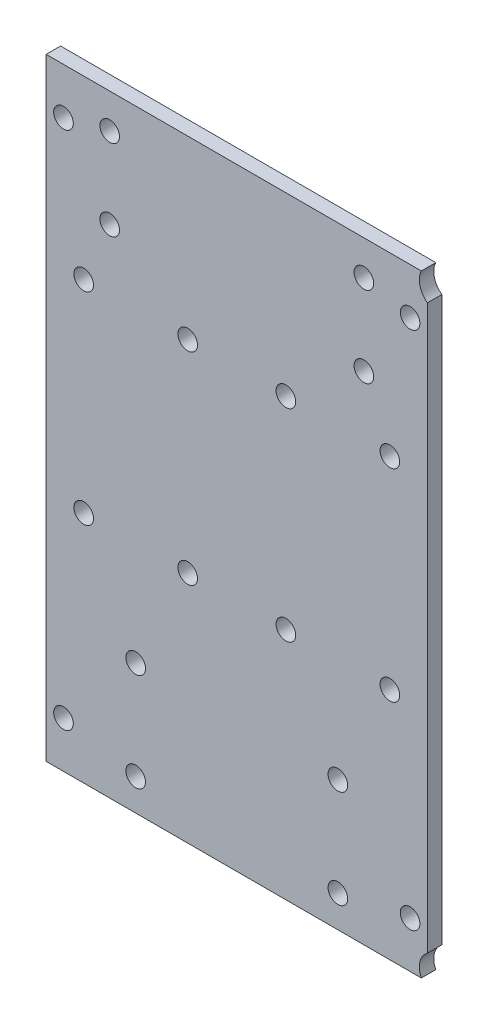
ISO-10303-21;
HEADER;
FILE_DESCRIPTION(('STEP AP214'),'2;1');
FILE_NAME('part.step','',(''),(''),'','','');
FILE_SCHEMA(('AUTOMOTIVE_DESIGN { 1 0 10303 214 1 1 1 1 }'));
ENDSEC;
DATA;
#1=APPLICATION_CONTEXT('core data for automotive mechanical design processes');
#2=APPLICATION_PROTOCOL_DEFINITION('international standard','automotive_design',2000,#1);
#3=PRODUCT_CONTEXT('',#1,'mechanical');
#4=PRODUCT('Part','Part','',(#3));
#5=PRODUCT_RELATED_PRODUCT_CATEGORY('part','',(#4));
#6=PRODUCT_DEFINITION_FORMATION('','',#4);
#7=PRODUCT_DEFINITION_CONTEXT('part definition',#1,'design');
#8=PRODUCT_DEFINITION('design','',#6,#7);
#9=PRODUCT_DEFINITION_SHAPE('','',#8);
#10=(LENGTH_UNIT() NAMED_UNIT(*) SI_UNIT(.MILLI.,.METRE.));
#11=(NAMED_UNIT(*) PLANE_ANGLE_UNIT() SI_UNIT($,.RADIAN.));
#12=(NAMED_UNIT(*) SI_UNIT($,.STERADIAN.) SOLID_ANGLE_UNIT());
#13=UNCERTAINTY_MEASURE_WITH_UNIT(LENGTH_MEASURE(1.E-05),#10,'distance_accuracy_value','');
#14=(GEOMETRIC_REPRESENTATION_CONTEXT(3) GLOBAL_UNCERTAINTY_ASSIGNED_CONTEXT((#13)) GLOBAL_UNIT_ASSIGNED_CONTEXT((#10,
#11,#12)) REPRESENTATION_CONTEXT('',''));
#15=CARTESIAN_POINT('',(0.,0.,0.));
#16=DIRECTION('',(0.,0.,1.));
#17=DIRECTION('',(1.,0.,0.));
#18=AXIS2_PLACEMENT_3D('',#15,#16,#17);
#19=CARTESIAN_POINT('',(-158.,53.,66.5));
#20=DIRECTION('',(-1.,0.,0.));
#21=DIRECTION('',(0.,0.,1.));
#22=AXIS2_PLACEMENT_3D('',#19,#20,#21);
#23=PLANE('',#22);
#24=DIRECTION('',(0.,-1.,0.));
#25=VECTOR('',#24,1.);
#26=CARTESIAN_POINT('',(-158.,53.,69.));
#27=LINE('',#26,#25);
#28=CARTESIAN_POINT('',(-158.,53.,69.));
#29=VERTEX_POINT('',#28);
#30=CARTESIAN_POINT('',(-158.,-53.,69.));
#31=VERTEX_POINT('',#30);
#32=EDGE_CURVE('E127',#29,#31,#27,.T.);
#33=ORIENTED_EDGE('',*,*,#32,.F.);
#34=DIRECTION('',(0.,0.,1.));
#35=VECTOR('',#34,1.);
#36=CARTESIAN_POINT('',(-158.,53.,66.5));
#37=LINE('',#36,#35);
#38=CARTESIAN_POINT('',(-158.,53.,66.5));
#39=VERTEX_POINT('',#38);
#40=EDGE_CURVE('E11',#39,#29,#37,.T.);
#41=ORIENTED_EDGE('',*,*,#40,.F.);
#42=DIRECTION('',(0.,-1.,0.));
#43=VECTOR('',#42,1.);
#44=CARTESIAN_POINT('',(-158.,53.,66.5));
#45=LINE('',#44,#43);
#46=CARTESIAN_POINT('',(-158.,-53.,66.5));
#47=VERTEX_POINT('',#46);
#48=EDGE_CURVE('E143',#39,#47,#45,.T.);
#49=ORIENTED_EDGE('',*,*,#48,.T.);
#50=DIRECTION('',(0.,0.,1.));
#51=VECTOR('',#50,1.);
#52=CARTESIAN_POINT('',(-158.,-53.,66.5));
#53=LINE('',#52,#51);
#54=EDGE_CURVE('E42',#47,#31,#53,.T.);
#55=ORIENTED_EDGE('',*,*,#54,.T.);
#56=EDGE_LOOP('',(#33,#41,#49,#55));
#57=FACE_BOUND('',#56,.T.);
#58=ADVANCED_FACE('F41',(#57),#23,.T.);
#59=CARTESIAN_POINT('',(-158.,53.,66.5));
#60=DIRECTION('',(0.,1.,0.));
#61=DIRECTION('',(0.,0.,1.));
#62=AXIS2_PLACEMENT_3D('',#59,#60,#61);
#63=PLANE('',#62);
#64=DIRECTION('',(-1.,0.,0.));
#65=VECTOR('',#64,1.);
#66=CARTESIAN_POINT('',(-158.,53.,69.));
#67=LINE('',#66,#65);
#68=CARTESIAN_POINT('',(-93.0512292604781,53.,69.));
#69=VERTEX_POINT('',#68);
#70=EDGE_CURVE('E136',#69,#29,#67,.T.);
#71=ORIENTED_EDGE('',*,*,#70,.F.);
#72=DIRECTION('',(0.,0.,1.));
#73=VECTOR('',#72,1.);
#74=CARTESIAN_POINT('',(-93.0512292604781,53.,66.5));
#75=LINE('',#74,#73);
#76=CARTESIAN_POINT('',(-93.0512292604781,53.,66.5));
#77=VERTEX_POINT('',#76);
#78=EDGE_CURVE('E49',#77,#69,#75,.T.);
#79=ORIENTED_EDGE('',*,*,#78,.F.);
#80=DIRECTION('',(-1.,0.,0.));
#81=VECTOR('',#80,1.);
#82=CARTESIAN_POINT('',(-158.,53.,66.5));
#83=LINE('',#82,#81);
#84=EDGE_CURVE('E117',#77,#39,#83,.T.);
#85=ORIENTED_EDGE('',*,*,#84,.T.);
#86=ORIENTED_EDGE('',*,*,#40,.T.);
#87=EDGE_LOOP('',(#71,#79,#85,#86));
#88=FACE_BOUND('',#87,.T.);
#89=ADVANCED_FACE('F149',(#88),#63,.T.);
#90=CARTESIAN_POINT('',(-90.0000000000001,51.5,66.5));
#91=DIRECTION('',(0.,0.,1.));
#92=DIRECTION('',(1.,0.,0.));
#93=AXIS2_PLACEMENT_3D('',#90,#91,#92);
#94=CYLINDRICAL_SURFACE('',#93,3.39999999999978);
#95=CARTESIAN_POINT('',(-90.0000000000001,51.5,69.));
#96=DIRECTION('',(0.,0.,-1.));
#97=DIRECTION('',(1.,0.,0.));
#98=AXIS2_PLACEMENT_3D('',#95,#96,#97);
#99=CIRCLE('',#98,3.39999999999978);
#100=CARTESIAN_POINT('',(-91.9999999999999,48.7504545830266,69.));
#101=VERTEX_POINT('',#100);
#102=EDGE_CURVE('E103',#101,#69,#99,.T.);
#103=ORIENTED_EDGE('',*,*,#102,.F.);
#104=DIRECTION('',(0.,0.,1.));
#105=VECTOR('',#104,1.);
#106=CARTESIAN_POINT('',(-91.9999999999999,48.7504545830266,66.5));
#107=LINE('',#106,#105);
#108=CARTESIAN_POINT('',(-91.9999999999999,48.7504545830266,66.5));
#109=VERTEX_POINT('',#108);
#110=EDGE_CURVE('E98',#109,#101,#107,.T.);
#111=ORIENTED_EDGE('',*,*,#110,.F.);
#112=CARTESIAN_POINT('',(-90.0000000000001,51.5,66.5));
#113=DIRECTION('',(0.,0.,-1.));
#114=DIRECTION('',(1.,0.,0.));
#115=AXIS2_PLACEMENT_3D('',#112,#113,#114);
#116=CIRCLE('',#115,3.39999999999978);
#117=EDGE_CURVE('E101',#109,#77,#116,.T.);
#118=ORIENTED_EDGE('',*,*,#117,.T.);
#119=ORIENTED_EDGE('',*,*,#78,.T.);
#120=EDGE_LOOP('',(#103,#111,#118,#119));
#121=FACE_BOUND('',#120,.T.);
#122=ADVANCED_FACE('F99',(#121),#94,.F.);
#123=CARTESIAN_POINT('',(-92.,48.7504545830265,66.5));
#124=DIRECTION('',(1.,0.,0.));
#125=DIRECTION('',(0.,0.,-1.));
#126=AXIS2_PLACEMENT_3D('',#123,#124,#125);
#127=PLANE('',#126);
#128=DIRECTION('',(0.,1.,0.));
#129=VECTOR('',#128,1.);
#130=CARTESIAN_POINT('',(-92.,48.7504545830265,69.));
#131=LINE('',#130,#129);
#132=CARTESIAN_POINT('',(-92.,-48.7504545830269,69.));
#133=VERTEX_POINT('',#132);
#134=EDGE_CURVE('E137',#133,#101,#131,.T.);
#135=ORIENTED_EDGE('',*,*,#134,.F.);
#136=DIRECTION('',(0.,0.,1.));
#137=VECTOR('',#136,1.);
#138=CARTESIAN_POINT('',(-92.,-48.7504545830269,66.5));
#139=LINE('',#138,#137);
#140=CARTESIAN_POINT('',(-92.,-48.7504545830269,66.5));
#141=VERTEX_POINT('',#140);
#142=EDGE_CURVE('E107',#141,#133,#139,.T.);
#143=ORIENTED_EDGE('',*,*,#142,.F.);
#144=DIRECTION('',(0.,1.,0.));
#145=VECTOR('',#144,1.);
#146=CARTESIAN_POINT('',(-92.,48.7504545830265,66.5));
#147=LINE('',#146,#145);
#148=EDGE_CURVE('E111',#141,#109,#147,.T.);
#149=ORIENTED_EDGE('',*,*,#148,.T.);
#150=ORIENTED_EDGE('',*,*,#110,.T.);
#151=EDGE_LOOP('',(#135,#143,#149,#150));
#152=FACE_BOUND('',#151,.T.);
#153=ADVANCED_FACE('F119',(#152),#127,.T.);
#154=CARTESIAN_POINT('',(-90.000000000001,-51.5000000000001,66.5));
#155=DIRECTION('',(0.,0.,1.));
#156=DIRECTION('',(1.,0.,0.));
#157=AXIS2_PLACEMENT_3D('',#154,#155,#156);
#158=CYLINDRICAL_SURFACE('',#157,3.39999999999932);
#159=CARTESIAN_POINT('',(-90.000000000001,-51.5000000000001,69.));
#160=DIRECTION('',(0.,0.,-1.));
#161=DIRECTION('',(1.,0.,0.));
#162=AXIS2_PLACEMENT_3D('',#159,#160,#161);
#163=CIRCLE('',#162,3.39999999999932);
#164=CARTESIAN_POINT('',(-93.0512292604786,-53.0000000000003,69.));
#165=VERTEX_POINT('',#164);
#166=EDGE_CURVE('E134',#165,#133,#163,.T.);
#167=ORIENTED_EDGE('',*,*,#166,.F.);
#168=DIRECTION('',(0.,0.,1.));
#169=VECTOR('',#168,1.);
#170=CARTESIAN_POINT('',(-93.0512292604786,-53.0000000000003,66.5));
#171=LINE('',#170,#169);
#172=CARTESIAN_POINT('',(-93.0512292604786,-53.0000000000003,66.5));
#173=VERTEX_POINT('',#172);
#174=EDGE_CURVE('E145',#173,#165,#171,.T.);
#175=ORIENTED_EDGE('',*,*,#174,.F.);
#176=CARTESIAN_POINT('',(-90.000000000001,-51.5000000000001,66.5));
#177=DIRECTION('',(0.,0.,-1.));
#178=DIRECTION('',(1.,0.,0.));
#179=AXIS2_PLACEMENT_3D('',#176,#177,#178);
#180=CIRCLE('',#179,3.39999999999932);
#181=EDGE_CURVE('E116',#173,#141,#180,.T.);
#182=ORIENTED_EDGE('',*,*,#181,.T.);
#183=ORIENTED_EDGE('',*,*,#142,.T.);
#184=EDGE_LOOP('',(#167,#175,#182,#183));
#185=FACE_BOUND('',#184,.T.);
#186=ADVANCED_FACE('F165',(#185),#158,.F.);
#187=CARTESIAN_POINT('',(-158.,-53.,66.5));
#188=DIRECTION('',(0.,-1.,0.));
#189=DIRECTION('',(1.,0.,0.));
#190=AXIS2_PLACEMENT_3D('',#187,#188,#189);
#191=PLANE('',#190);
#192=DIRECTION('',(1.,0.,0.));
#193=VECTOR('',#192,1.);
#194=CARTESIAN_POINT('',(-158.,-53.,69.));
#195=LINE('',#194,#193);
#196=EDGE_CURVE('E129',#31,#165,#195,.T.);
#197=ORIENTED_EDGE('',*,*,#196,.F.);
#198=ORIENTED_EDGE('',*,*,#54,.F.);
#199=DIRECTION('',(1.,0.,0.));
#200=VECTOR('',#199,1.);
#201=CARTESIAN_POINT('',(-158.,-53.,66.5));
#202=LINE('',#201,#200);
#203=EDGE_CURVE('E122',#47,#173,#202,.T.);
#204=ORIENTED_EDGE('',*,*,#203,.T.);
#205=ORIENTED_EDGE('',*,*,#174,.T.);
#206=EDGE_LOOP('',(#197,#198,#204,#205));
#207=FACE_BOUND('',#206,.T.);
#208=ADVANCED_FACE('F148',(#207),#191,.T.);
#209=CARTESIAN_POINT('',(-90.000000000001,-51.5000000000001,66.5));
#210=DIRECTION('',(0.,0.,1.));
#211=DIRECTION('',(1.,0.,0.));
#212=AXIS2_PLACEMENT_3D('',#209,#210,#211);
#213=PLANE('',#212);
#214=CARTESIAN_POINT('',(-95.,45.,66.5));
#215=DIRECTION('',(0.,0.,1.));
#216=DIRECTION('',(1.,0.,0.));
#217=AXIS2_PLACEMENT_3D('',#214,#215,#216);
#218=CIRCLE('',#217,1.69999999999999);
#219=CARTESIAN_POINT('',(-93.3,45.,66.5));
#220=VERTEX_POINT('',#219);
#221=EDGE_CURVE('E257',#220,#220,#218,.T.);
#222=ORIENTED_EDGE('',*,*,#221,.T.);
#223=EDGE_LOOP('',(#222));
#224=FACE_BOUND('',#223,.T.);
#225=CARTESIAN_POINT('',(-103.,47.,66.5));
#226=DIRECTION('',(0.,0.,1.));
#227=DIRECTION('',(1.,0.,0.));
#228=AXIS2_PLACEMENT_3D('',#225,#226,#227);
#229=CIRCLE('',#228,1.69999999999999);
#230=CARTESIAN_POINT('',(-101.3,47.,66.5));
#231=VERTEX_POINT('',#230);
#232=EDGE_CURVE('E268',#231,#231,#229,.T.);
#233=ORIENTED_EDGE('',*,*,#232,.T.);
#234=EDGE_LOOP('',(#233));
#235=FACE_BOUND('',#234,.T.);
#236=CARTESIAN_POINT('',(-103.,33.,66.5));
#237=DIRECTION('',(0.,0.,1.));
#238=DIRECTION('',(1.,0.,0.));
#239=AXIS2_PLACEMENT_3D('',#236,#237,#238);
#240=CIRCLE('',#239,1.69999999999999);
#241=CARTESIAN_POINT('',(-101.3,33.,66.5));
#242=VERTEX_POINT('',#241);
#243=EDGE_CURVE('E273',#242,#242,#240,.T.);
#244=ORIENTED_EDGE('',*,*,#243,.T.);
#245=EDGE_LOOP('',(#244));
#246=FACE_BOUND('',#245,.T.);
#247=CARTESIAN_POINT('',(-98.5,22.5,66.5));
#248=DIRECTION('',(0.,0.,1.));
#249=DIRECTION('',(1.,0.,0.));
#250=AXIS2_PLACEMENT_3D('',#247,#248,#249);
#251=CIRCLE('',#250,1.69999999999999);
#252=CARTESIAN_POINT('',(-96.8,22.5,66.5));
#253=VERTEX_POINT('',#252);
#254=EDGE_CURVE('E278',#253,#253,#251,.T.);
#255=ORIENTED_EDGE('',*,*,#254,.T.);
#256=EDGE_LOOP('',(#255));
#257=FACE_BOUND('',#256,.T.);
#258=CARTESIAN_POINT('',(-116.5,22.5,66.5));
#259=DIRECTION('',(0.,0.,1.));
#260=DIRECTION('',(1.,0.,0.));
#261=AXIS2_PLACEMENT_3D('',#258,#259,#260);
#262=CIRCLE('',#261,1.69999999999999);
#263=CARTESIAN_POINT('',(-114.8,22.5,66.5));
#264=VERTEX_POINT('',#263);
#265=EDGE_CURVE('E287',#264,#264,#262,.T.);
#266=ORIENTED_EDGE('',*,*,#265,.T.);
#267=EDGE_LOOP('',(#266));
#268=FACE_BOUND('',#267,.T.);
#269=CARTESIAN_POINT('',(-147.,47.,66.5));
#270=DIRECTION('',(0.,0.,1.));
#271=DIRECTION('',(1.,0.,0.));
#272=AXIS2_PLACEMENT_3D('',#269,#270,#271);
#273=CIRCLE('',#272,1.70000000000001);
#274=CARTESIAN_POINT('',(-145.3,47.,66.5));
#275=VERTEX_POINT('',#274);
#276=EDGE_CURVE('E295',#275,#275,#273,.T.);
#277=ORIENTED_EDGE('',*,*,#276,.T.);
#278=EDGE_LOOP('',(#277));
#279=FACE_BOUND('',#278,.T.);
#280=CARTESIAN_POINT('',(-155.,45.,66.5));
#281=DIRECTION('',(0.,0.,1.));
#282=DIRECTION('',(1.,0.,0.));
#283=AXIS2_PLACEMENT_3D('',#280,#281,#282);
#284=CIRCLE('',#283,1.70000000000001);
#285=CARTESIAN_POINT('',(-153.3,45.,66.5));
#286=VERTEX_POINT('',#285);
#287=EDGE_CURVE('E299',#286,#286,#284,.T.);
#288=ORIENTED_EDGE('',*,*,#287,.T.);
#289=EDGE_LOOP('',(#288));
#290=FACE_BOUND('',#289,.T.);
#291=CARTESIAN_POINT('',(-147.,33.,66.5));
#292=DIRECTION('',(0.,0.,1.));
#293=DIRECTION('',(1.,0.,0.));
#294=AXIS2_PLACEMENT_3D('',#291,#292,#293);
#295=CIRCLE('',#294,1.70000000000001);
#296=CARTESIAN_POINT('',(-145.3,33.,66.5));
#297=VERTEX_POINT('',#296);
#298=EDGE_CURVE('E301',#297,#297,#295,.T.);
#299=ORIENTED_EDGE('',*,*,#298,.T.);
#300=EDGE_LOOP('',(#299));
#301=FACE_BOUND('',#300,.T.);
#302=CARTESIAN_POINT('',(-133.5,22.5,66.5));
#303=DIRECTION('',(0.,0.,1.));
#304=DIRECTION('',(1.,0.,0.));
#305=AXIS2_PLACEMENT_3D('',#302,#303,#304);
#306=CIRCLE('',#305,1.70000000000001);
#307=CARTESIAN_POINT('',(-131.8,22.5,66.5));
#308=VERTEX_POINT('',#307);
#309=EDGE_CURVE('E309',#308,#308,#306,.T.);
#310=ORIENTED_EDGE('',*,*,#309,.T.);
#311=EDGE_LOOP('',(#310));
#312=FACE_BOUND('',#311,.T.);
#313=CARTESIAN_POINT('',(-151.5,22.5,66.5));
#314=DIRECTION('',(0.,0.,1.));
#315=DIRECTION('',(1.,0.,0.));
#316=AXIS2_PLACEMENT_3D('',#313,#314,#315);
#317=CIRCLE('',#316,1.70000000000001);
#318=CARTESIAN_POINT('',(-149.8,22.5,66.5));
#319=VERTEX_POINT('',#318);
#320=EDGE_CURVE('E316',#319,#319,#317,.T.);
#321=ORIENTED_EDGE('',*,*,#320,.T.);
#322=EDGE_LOOP('',(#321));
#323=FACE_BOUND('',#322,.T.);
#324=CARTESIAN_POINT('',(-98.5,-12.5,66.5));
#325=DIRECTION('',(0.,0.,1.));
#326=DIRECTION('',(1.,0.,0.));
#327=AXIS2_PLACEMENT_3D('',#324,#325,#326);
#328=CIRCLE('',#327,1.69999999999999);
#329=CARTESIAN_POINT('',(-96.8,-12.5,66.5));
#330=VERTEX_POINT('',#329);
#331=EDGE_CURVE('E325',#330,#330,#328,.T.);
#332=ORIENTED_EDGE('',*,*,#331,.T.);
#333=EDGE_LOOP('',(#332));
#334=FACE_BOUND('',#333,.T.);
#335=CARTESIAN_POINT('',(-116.5,-12.5,66.5));
#336=DIRECTION('',(0.,0.,1.));
#337=DIRECTION('',(1.,0.,0.));
#338=AXIS2_PLACEMENT_3D('',#335,#336,#337);
#339=CIRCLE('',#338,1.69999999999999);
#340=CARTESIAN_POINT('',(-114.8,-12.5,66.5));
#341=VERTEX_POINT('',#340);
#342=EDGE_CURVE('E327',#341,#341,#339,.T.);
#343=ORIENTED_EDGE('',*,*,#342,.T.);
#344=EDGE_LOOP('',(#343));
#345=FACE_BOUND('',#344,.T.);
#346=CARTESIAN_POINT('',(-107.5,-30.5,66.5));
#347=DIRECTION('',(0.,0.,1.));
#348=DIRECTION('',(1.,0.,0.));
#349=AXIS2_PLACEMENT_3D('',#346,#347,#348);
#350=CIRCLE('',#349,1.69999999999999);
#351=CARTESIAN_POINT('',(-105.8,-30.5,66.5));
#352=VERTEX_POINT('',#351);
#353=EDGE_CURVE('E331',#352,#352,#350,.T.);
#354=ORIENTED_EDGE('',*,*,#353,.T.);
#355=EDGE_LOOP('',(#354));
#356=FACE_BOUND('',#355,.T.);
#357=CARTESIAN_POINT('',(-95.,-45.,66.5));
#358=DIRECTION('',(0.,0.,1.));
#359=DIRECTION('',(1.,0.,0.));
#360=AXIS2_PLACEMENT_3D('',#357,#358,#359);
#361=CIRCLE('',#360,1.69999999999999);
#362=CARTESIAN_POINT('',(-93.3,-45.,66.5));
#363=VERTEX_POINT('',#362);
#364=EDGE_CURVE('E338',#363,#363,#361,.T.);
#365=ORIENTED_EDGE('',*,*,#364,.T.);
#366=EDGE_LOOP('',(#365));
#367=FACE_BOUND('',#366,.T.);
#368=CARTESIAN_POINT('',(-107.5,-47.5,66.5));
#369=DIRECTION('',(0.,0.,1.));
#370=DIRECTION('',(1.,0.,0.));
#371=AXIS2_PLACEMENT_3D('',#368,#369,#370);
#372=CIRCLE('',#371,1.69999999999999);
#373=CARTESIAN_POINT('',(-105.8,-47.5,66.5));
#374=VERTEX_POINT('',#373);
#375=EDGE_CURVE('E347',#374,#374,#372,.T.);
#376=ORIENTED_EDGE('',*,*,#375,.T.);
#377=EDGE_LOOP('',(#376));
#378=FACE_BOUND('',#377,.T.);
#379=CARTESIAN_POINT('',(-133.5,-12.5,66.5));
#380=DIRECTION('',(0.,0.,1.));
#381=DIRECTION('',(1.,0.,0.));
#382=AXIS2_PLACEMENT_3D('',#379,#380,#381);
#383=CIRCLE('',#382,1.70000000000001);
#384=CARTESIAN_POINT('',(-131.8,-12.5,66.5));
#385=VERTEX_POINT('',#384);
#386=EDGE_CURVE('E355',#385,#385,#383,.T.);
#387=ORIENTED_EDGE('',*,*,#386,.T.);
#388=EDGE_LOOP('',(#387));
#389=FACE_BOUND('',#388,.T.);
#390=CARTESIAN_POINT('',(-151.5,-12.5,66.5));
#391=DIRECTION('',(0.,0.,1.));
#392=DIRECTION('',(1.,0.,0.));
#393=AXIS2_PLACEMENT_3D('',#390,#391,#392);
#394=CIRCLE('',#393,1.70000000000001);
#395=CARTESIAN_POINT('',(-149.8,-12.5,66.5));
#396=VERTEX_POINT('',#395);
#397=EDGE_CURVE('E359',#396,#396,#394,.T.);
#398=ORIENTED_EDGE('',*,*,#397,.T.);
#399=EDGE_LOOP('',(#398));
#400=FACE_BOUND('',#399,.T.);
#401=CARTESIAN_POINT('',(-142.5,-30.5,66.5));
#402=DIRECTION('',(0.,0.,1.));
#403=DIRECTION('',(1.,0.,0.));
#404=AXIS2_PLACEMENT_3D('',#401,#402,#403);
#405=CIRCLE('',#404,1.70000000000001);
#406=CARTESIAN_POINT('',(-140.8,-30.5,66.5));
#407=VERTEX_POINT('',#406);
#408=EDGE_CURVE('E365',#407,#407,#405,.T.);
#409=ORIENTED_EDGE('',*,*,#408,.T.);
#410=EDGE_LOOP('',(#409));
#411=FACE_BOUND('',#410,.T.);
#412=CARTESIAN_POINT('',(-142.5,-47.5,66.5));
#413=DIRECTION('',(0.,0.,1.));
#414=DIRECTION('',(1.,0.,0.));
#415=AXIS2_PLACEMENT_3D('',#412,#413,#414);
#416=CIRCLE('',#415,1.70000000000001);
#417=CARTESIAN_POINT('',(-140.8,-47.5,66.5));
#418=VERTEX_POINT('',#417);
#419=EDGE_CURVE('E367',#418,#418,#416,.T.);
#420=ORIENTED_EDGE('',*,*,#419,.T.);
#421=EDGE_LOOP('',(#420));
#422=FACE_BOUND('',#421,.T.);
#423=CARTESIAN_POINT('',(-155.,-45.,66.5));
#424=DIRECTION('',(0.,0.,1.));
#425=DIRECTION('',(1.,0.,0.));
#426=AXIS2_PLACEMENT_3D('',#423,#424,#425);
#427=CIRCLE('',#426,1.70000000000001);
#428=CARTESIAN_POINT('',(-153.3,-45.,66.5));
#429=VERTEX_POINT('',#428);
#430=EDGE_CURVE('E128',#429,#429,#427,.T.);
#431=ORIENTED_EDGE('',*,*,#430,.T.);
#432=EDGE_LOOP('',(#431));
#433=FACE_BOUND('',#432,.T.);
#434=ORIENTED_EDGE('',*,*,#48,.F.);
#435=ORIENTED_EDGE('',*,*,#84,.F.);
#436=ORIENTED_EDGE('',*,*,#117,.F.);
#437=ORIENTED_EDGE('',*,*,#148,.F.);
#438=ORIENTED_EDGE('',*,*,#181,.F.);
#439=ORIENTED_EDGE('',*,*,#203,.F.);
#440=EDGE_LOOP('',(#434,#435,#436,#437,#438,#439));
#441=FACE_BOUND('',#440,.T.);
#442=ADVANCED_FACE('F115',(#224,#235,#246,#257,#268,#279,#290,#301,#312,#323,#334,#345,#356,
#367,#378,#389,#400,#411,#422,#433,#441),#213,.F.);
#443=CARTESIAN_POINT('',(-90.000000000001,-51.5000000000001,69.));
#444=DIRECTION('',(0.,0.,1.));
#445=DIRECTION('',(1.,0.,0.));
#446=AXIS2_PLACEMENT_3D('',#443,#444,#445);
#447=PLANE('',#446);
#448=CARTESIAN_POINT('',(-95.,45.,69.));
#449=DIRECTION('',(0.,0.,1.));
#450=DIRECTION('',(1.,0.,0.));
#451=AXIS2_PLACEMENT_3D('',#448,#449,#450);
#452=CIRCLE('',#451,1.69999999999999);
#453=CARTESIAN_POINT('',(-93.3,45.,69.));
#454=VERTEX_POINT('',#453);
#455=EDGE_CURVE('E263',#454,#454,#452,.T.);
#456=ORIENTED_EDGE('',*,*,#455,.F.);
#457=EDGE_LOOP('',(#456));
#458=FACE_BOUND('',#457,.T.);
#459=CARTESIAN_POINT('',(-103.,47.,69.));
#460=DIRECTION('',(0.,0.,1.));
#461=DIRECTION('',(1.,0.,0.));
#462=AXIS2_PLACEMENT_3D('',#459,#460,#461);
#463=CIRCLE('',#462,1.69999999999999);
#464=CARTESIAN_POINT('',(-101.3,47.,69.));
#465=VERTEX_POINT('',#464);
#466=EDGE_CURVE('E264',#465,#465,#463,.T.);
#467=ORIENTED_EDGE('',*,*,#466,.F.);
#468=EDGE_LOOP('',(#467));
#469=FACE_BOUND('',#468,.T.);
#470=CARTESIAN_POINT('',(-103.,33.,69.));
#471=DIRECTION('',(0.,0.,1.));
#472=DIRECTION('',(1.,0.,0.));
#473=AXIS2_PLACEMENT_3D('',#470,#471,#472);
#474=CIRCLE('',#473,1.69999999999999);
#475=CARTESIAN_POINT('',(-101.3,33.,69.));
#476=VERTEX_POINT('',#475);
#477=EDGE_CURVE('E271',#476,#476,#474,.T.);
#478=ORIENTED_EDGE('',*,*,#477,.F.);
#479=EDGE_LOOP('',(#478));
#480=FACE_BOUND('',#479,.T.);
#481=CARTESIAN_POINT('',(-98.5,22.5,69.));
#482=DIRECTION('',(0.,0.,1.));
#483=DIRECTION('',(1.,0.,0.));
#484=AXIS2_PLACEMENT_3D('',#481,#482,#483);
#485=CIRCLE('',#484,1.69999999999999);
#486=CARTESIAN_POINT('',(-96.8,22.5,69.));
#487=VERTEX_POINT('',#486);
#488=EDGE_CURVE('E280',#487,#487,#485,.T.);
#489=ORIENTED_EDGE('',*,*,#488,.F.);
#490=EDGE_LOOP('',(#489));
#491=FACE_BOUND('',#490,.T.);
#492=CARTESIAN_POINT('',(-116.5,22.5,69.));
#493=DIRECTION('',(0.,0.,1.));
#494=DIRECTION('',(1.,0.,0.));
#495=AXIS2_PLACEMENT_3D('',#492,#493,#494);
#496=CIRCLE('',#495,1.69999999999999);
#497=CARTESIAN_POINT('',(-114.8,22.5,69.));
#498=VERTEX_POINT('',#497);
#499=EDGE_CURVE('E284',#498,#498,#496,.T.);
#500=ORIENTED_EDGE('',*,*,#499,.F.);
#501=EDGE_LOOP('',(#500));
#502=FACE_BOUND('',#501,.T.);
#503=CARTESIAN_POINT('',(-147.,47.,69.));
#504=DIRECTION('',(0.,0.,1.));
#505=DIRECTION('',(1.,0.,0.));
#506=AXIS2_PLACEMENT_3D('',#503,#504,#505);
#507=CIRCLE('',#506,1.70000000000001);
#508=CARTESIAN_POINT('',(-145.3,47.,69.));
#509=VERTEX_POINT('',#508);
#510=EDGE_CURVE('E286',#509,#509,#507,.T.);
#511=ORIENTED_EDGE('',*,*,#510,.F.);
#512=EDGE_LOOP('',(#511));
#513=FACE_BOUND('',#512,.T.);
#514=CARTESIAN_POINT('',(-155.,45.,69.));
#515=DIRECTION('',(0.,0.,1.));
#516=DIRECTION('',(1.,0.,0.));
#517=AXIS2_PLACEMENT_3D('',#514,#515,#516);
#518=CIRCLE('',#517,1.70000000000001);
#519=CARTESIAN_POINT('',(-153.3,45.,69.));
#520=VERTEX_POINT('',#519);
#521=EDGE_CURVE('E293',#520,#520,#518,.T.);
#522=ORIENTED_EDGE('',*,*,#521,.F.);
#523=EDGE_LOOP('',(#522));
#524=FACE_BOUND('',#523,.T.);
#525=CARTESIAN_POINT('',(-147.,33.,69.));
#526=DIRECTION('',(0.,0.,1.));
#527=DIRECTION('',(1.,0.,0.));
#528=AXIS2_PLACEMENT_3D('',#525,#526,#527);
#529=CIRCLE('',#528,1.70000000000001);
#530=CARTESIAN_POINT('',(-145.3,33.,69.));
#531=VERTEX_POINT('',#530);
#532=EDGE_CURVE('E302',#531,#531,#529,.T.);
#533=ORIENTED_EDGE('',*,*,#532,.F.);
#534=EDGE_LOOP('',(#533));
#535=FACE_BOUND('',#534,.T.);
#536=CARTESIAN_POINT('',(-133.5,22.5,69.));
#537=DIRECTION('',(0.,0.,1.));
#538=DIRECTION('',(1.,0.,0.));
#539=AXIS2_PLACEMENT_3D('',#536,#537,#538);
#540=CIRCLE('',#539,1.70000000000001);
#541=CARTESIAN_POINT('',(-131.8,22.5,69.));
#542=VERTEX_POINT('',#541);
#543=EDGE_CURVE('E307',#542,#542,#540,.T.);
#544=ORIENTED_EDGE('',*,*,#543,.F.);
#545=EDGE_LOOP('',(#544));
#546=FACE_BOUND('',#545,.T.);
#547=CARTESIAN_POINT('',(-151.5,22.5,69.));
#548=DIRECTION('',(0.,0.,1.));
#549=DIRECTION('',(1.,0.,0.));
#550=AXIS2_PLACEMENT_3D('',#547,#548,#549);
#551=CIRCLE('',#550,1.70000000000001);
#552=CARTESIAN_POINT('',(-149.8,22.5,69.));
#553=VERTEX_POINT('',#552);
#554=EDGE_CURVE('E311',#553,#553,#551,.T.);
#555=ORIENTED_EDGE('',*,*,#554,.F.);
#556=EDGE_LOOP('',(#555));
#557=FACE_BOUND('',#556,.T.);
#558=CARTESIAN_POINT('',(-98.5,-12.5,69.));
#559=DIRECTION('',(0.,0.,1.));
#560=DIRECTION('',(1.,0.,0.));
#561=AXIS2_PLACEMENT_3D('',#558,#559,#560);
#562=CIRCLE('',#561,1.69999999999999);
#563=CARTESIAN_POINT('',(-96.8,-12.5,69.));
#564=VERTEX_POINT('',#563);
#565=EDGE_CURVE('E317',#564,#564,#562,.T.);
#566=ORIENTED_EDGE('',*,*,#565,.F.);
#567=EDGE_LOOP('',(#566));
#568=FACE_BOUND('',#567,.T.);
#569=CARTESIAN_POINT('',(-116.5,-12.5,69.));
#570=DIRECTION('',(0.,0.,1.));
#571=DIRECTION('',(1.,0.,0.));
#572=AXIS2_PLACEMENT_3D('',#569,#570,#571);
#573=CIRCLE('',#572,1.69999999999999);
#574=CARTESIAN_POINT('',(-114.8,-12.5,69.));
#575=VERTEX_POINT('',#574);
#576=EDGE_CURVE('E324',#575,#575,#573,.T.);
#577=ORIENTED_EDGE('',*,*,#576,.F.);
#578=EDGE_LOOP('',(#577));
#579=FACE_BOUND('',#578,.T.);
#580=CARTESIAN_POINT('',(-107.5,-30.5,69.));
#581=DIRECTION('',(0.,0.,1.));
#582=DIRECTION('',(1.,0.,0.));
#583=AXIS2_PLACEMENT_3D('',#580,#581,#582);
#584=CIRCLE('',#583,1.69999999999999);
#585=CARTESIAN_POINT('',(-105.8,-30.5,69.));
#586=VERTEX_POINT('',#585);
#587=EDGE_CURVE('E332',#586,#586,#584,.T.);
#588=ORIENTED_EDGE('',*,*,#587,.F.);
#589=EDGE_LOOP('',(#588));
#590=FACE_BOUND('',#589,.T.);
#591=CARTESIAN_POINT('',(-95.,-45.,69.));
#592=DIRECTION('',(0.,0.,1.));
#593=DIRECTION('',(1.,0.,0.));
#594=AXIS2_PLACEMENT_3D('',#591,#592,#593);
#595=CIRCLE('',#594,1.69999999999999);
#596=CARTESIAN_POINT('',(-93.3,-45.,69.));
#597=VERTEX_POINT('',#596);
#598=EDGE_CURVE('E340',#597,#597,#595,.T.);
#599=ORIENTED_EDGE('',*,*,#598,.F.);
#600=EDGE_LOOP('',(#599));
#601=FACE_BOUND('',#600,.T.);
#602=CARTESIAN_POINT('',(-107.5,-47.5,69.));
#603=DIRECTION('',(0.,0.,1.));
#604=DIRECTION('',(1.,0.,0.));
#605=AXIS2_PLACEMENT_3D('',#602,#603,#604);
#606=CIRCLE('',#605,1.69999999999999);
#607=CARTESIAN_POINT('',(-105.8,-47.5,69.));
#608=VERTEX_POINT('',#607);
#609=EDGE_CURVE('E344',#608,#608,#606,.T.);
#610=ORIENTED_EDGE('',*,*,#609,.F.);
#611=EDGE_LOOP('',(#610));
#612=FACE_BOUND('',#611,.T.);
#613=CARTESIAN_POINT('',(-133.5,-12.5,69.));
#614=DIRECTION('',(0.,0.,1.));
#615=DIRECTION('',(1.,0.,0.));
#616=AXIS2_PLACEMENT_3D('',#613,#614,#615);
#617=CIRCLE('',#616,1.70000000000001);
#618=CARTESIAN_POINT('',(-131.8,-12.5,69.));
#619=VERTEX_POINT('',#618);
#620=EDGE_CURVE('E349',#619,#619,#617,.T.);
#621=ORIENTED_EDGE('',*,*,#620,.F.);
#622=EDGE_LOOP('',(#621));
#623=FACE_BOUND('',#622,.T.);
#624=CARTESIAN_POINT('',(-151.5,-12.5,69.));
#625=DIRECTION('',(0.,0.,1.));
#626=DIRECTION('',(1.,0.,0.));
#627=AXIS2_PLACEMENT_3D('',#624,#625,#626);
#628=CIRCLE('',#627,1.70000000000001);
#629=CARTESIAN_POINT('',(-149.8,-12.5,69.));
#630=VERTEX_POINT('',#629);
#631=EDGE_CURVE('E353',#630,#630,#628,.T.);
#632=ORIENTED_EDGE('',*,*,#631,.F.);
#633=EDGE_LOOP('',(#632));
#634=FACE_BOUND('',#633,.T.);
#635=CARTESIAN_POINT('',(-142.5,-30.5,69.));
#636=DIRECTION('',(0.,0.,1.));
#637=DIRECTION('',(1.,0.,0.));
#638=AXIS2_PLACEMENT_3D('',#635,#636,#637);
#639=CIRCLE('',#638,1.70000000000001);
#640=CARTESIAN_POINT('',(-140.8,-30.5,69.));
#641=VERTEX_POINT('',#640);
#642=EDGE_CURVE('E363',#641,#641,#639,.T.);
#643=ORIENTED_EDGE('',*,*,#642,.F.);
#644=EDGE_LOOP('',(#643));
#645=FACE_BOUND('',#644,.T.);
#646=CARTESIAN_POINT('',(-142.5,-47.5,69.));
#647=DIRECTION('',(0.,0.,1.));
#648=DIRECTION('',(1.,0.,0.));
#649=AXIS2_PLACEMENT_3D('',#646,#647,#648);
#650=CIRCLE('',#649,1.70000000000001);
#651=CARTESIAN_POINT('',(-140.8,-47.5,69.));
#652=VERTEX_POINT('',#651);
#653=EDGE_CURVE('E370',#652,#652,#650,.T.);
#654=ORIENTED_EDGE('',*,*,#653,.F.);
#655=EDGE_LOOP('',(#654));
#656=FACE_BOUND('',#655,.T.);
#657=CARTESIAN_POINT('',(-155.,-45.,69.));
#658=DIRECTION('',(0.,0.,1.));
#659=DIRECTION('',(1.,0.,0.));
#660=AXIS2_PLACEMENT_3D('',#657,#658,#659);
#661=CIRCLE('',#660,1.70000000000001);
#662=CARTESIAN_POINT('',(-153.3,-45.,69.));
#663=VERTEX_POINT('',#662);
#664=EDGE_CURVE('E373',#663,#663,#661,.T.);
#665=ORIENTED_EDGE('',*,*,#664,.F.);
#666=EDGE_LOOP('',(#665));
#667=FACE_BOUND('',#666,.T.);
#668=ORIENTED_EDGE('',*,*,#32,.T.);
#669=ORIENTED_EDGE('',*,*,#196,.T.);
#670=ORIENTED_EDGE('',*,*,#166,.T.);
#671=ORIENTED_EDGE('',*,*,#134,.T.);
#672=ORIENTED_EDGE('',*,*,#102,.T.);
#673=ORIENTED_EDGE('',*,*,#70,.T.);
#674=EDGE_LOOP('',(#668,#669,#670,#671,#672,#673));
#675=FACE_BOUND('',#674,.T.);
#676=ADVANCED_FACE('F146',(#458,#469,#480,#491,#502,#513,#524,#535,#546,#557,#568,#579,#590,
#601,#612,#623,#634,#645,#656,#667,#675),#447,.T.);
#677=CARTESIAN_POINT('',(-155.,-45.,66.5));
#678=DIRECTION('',(0.,0.,1.));
#679=DIRECTION('',(1.,0.,0.));
#680=AXIS2_PLACEMENT_3D('',#677,#678,#679);
#681=CYLINDRICAL_SURFACE('',#680,1.70000000000001);
#682=ORIENTED_EDGE('',*,*,#430,.F.);
#683=EDGE_LOOP('',(#682));
#684=FACE_BOUND('',#683,.T.);
#685=ORIENTED_EDGE('',*,*,#664,.T.);
#686=EDGE_LOOP('',(#685));
#687=FACE_BOUND('',#686,.T.);
#688=ADVANCED_FACE('F174',(#684,#687),#681,.F.);
#689=CARTESIAN_POINT('',(-142.5,-47.5,66.5));
#690=DIRECTION('',(0.,0.,1.));
#691=DIRECTION('',(1.,0.,0.));
#692=AXIS2_PLACEMENT_3D('',#689,#690,#691);
#693=CYLINDRICAL_SURFACE('',#692,1.70000000000001);
#694=ORIENTED_EDGE('',*,*,#419,.F.);
#695=EDGE_LOOP('',(#694));
#696=FACE_BOUND('',#695,.T.);
#697=ORIENTED_EDGE('',*,*,#653,.T.);
#698=EDGE_LOOP('',(#697));
#699=FACE_BOUND('',#698,.T.);
#700=ADVANCED_FACE('F178',(#696,#699),#693,.F.);
#701=CARTESIAN_POINT('',(-142.5,-30.5,66.5));
#702=DIRECTION('',(0.,0.,1.));
#703=DIRECTION('',(1.,0.,0.));
#704=AXIS2_PLACEMENT_3D('',#701,#702,#703);
#705=CYLINDRICAL_SURFACE('',#704,1.70000000000001);
#706=ORIENTED_EDGE('',*,*,#408,.F.);
#707=EDGE_LOOP('',(#706));
#708=FACE_BOUND('',#707,.T.);
#709=ORIENTED_EDGE('',*,*,#642,.T.);
#710=EDGE_LOOP('',(#709));
#711=FACE_BOUND('',#710,.T.);
#712=ADVANCED_FACE('F184',(#708,#711),#705,.F.);
#713=CARTESIAN_POINT('',(-151.5,-12.5,66.5));
#714=DIRECTION('',(0.,0.,1.));
#715=DIRECTION('',(1.,0.,0.));
#716=AXIS2_PLACEMENT_3D('',#713,#714,#715);
#717=CYLINDRICAL_SURFACE('',#716,1.70000000000001);
#718=ORIENTED_EDGE('',*,*,#397,.F.);
#719=EDGE_LOOP('',(#718));
#720=FACE_BOUND('',#719,.T.);
#721=ORIENTED_EDGE('',*,*,#631,.T.);
#722=EDGE_LOOP('',(#721));
#723=FACE_BOUND('',#722,.T.);
#724=ADVANCED_FACE('F189',(#720,#723),#717,.F.);
#725=CARTESIAN_POINT('',(-133.5,-12.5,66.5));
#726=DIRECTION('',(0.,0.,1.));
#727=DIRECTION('',(1.,0.,0.));
#728=AXIS2_PLACEMENT_3D('',#725,#726,#727);
#729=CYLINDRICAL_SURFACE('',#728,1.70000000000001);
#730=ORIENTED_EDGE('',*,*,#386,.F.);
#731=EDGE_LOOP('',(#730));
#732=FACE_BOUND('',#731,.T.);
#733=ORIENTED_EDGE('',*,*,#620,.T.);
#734=EDGE_LOOP('',(#733));
#735=FACE_BOUND('',#734,.T.);
#736=ADVANCED_FACE('F195',(#732,#735),#729,.F.);
#737=CARTESIAN_POINT('',(-107.5,-47.5,66.5));
#738=DIRECTION('',(0.,0.,1.));
#739=DIRECTION('',(1.,0.,0.));
#740=AXIS2_PLACEMENT_3D('',#737,#738,#739);
#741=CYLINDRICAL_SURFACE('',#740,1.69999999999999);
#742=ORIENTED_EDGE('',*,*,#375,.F.);
#743=EDGE_LOOP('',(#742));
#744=FACE_BOUND('',#743,.T.);
#745=ORIENTED_EDGE('',*,*,#609,.T.);
#746=EDGE_LOOP('',(#745));
#747=FACE_BOUND('',#746,.T.);
#748=ADVANCED_FACE('F198',(#744,#747),#741,.F.);
#749=CARTESIAN_POINT('',(-95.,-45.,66.5));
#750=DIRECTION('',(0.,0.,1.));
#751=DIRECTION('',(1.,0.,0.));
#752=AXIS2_PLACEMENT_3D('',#749,#750,#751);
#753=CYLINDRICAL_SURFACE('',#752,1.69999999999999);
#754=ORIENTED_EDGE('',*,*,#364,.F.);
#755=EDGE_LOOP('',(#754));
#756=FACE_BOUND('',#755,.T.);
#757=ORIENTED_EDGE('',*,*,#598,.T.);
#758=EDGE_LOOP('',(#757));
#759=FACE_BOUND('',#758,.T.);
#760=ADVANCED_FACE('F199',(#756,#759),#753,.F.);
#761=CARTESIAN_POINT('',(-107.5,-30.5,66.5));
#762=DIRECTION('',(0.,0.,1.));
#763=DIRECTION('',(1.,0.,0.));
#764=AXIS2_PLACEMENT_3D('',#761,#762,#763);
#765=CYLINDRICAL_SURFACE('',#764,1.69999999999999);
#766=ORIENTED_EDGE('',*,*,#353,.F.);
#767=EDGE_LOOP('',(#766));
#768=FACE_BOUND('',#767,.T.);
#769=ORIENTED_EDGE('',*,*,#587,.T.);
#770=EDGE_LOOP('',(#769));
#771=FACE_BOUND('',#770,.T.);
#772=ADVANCED_FACE('F204',(#768,#771),#765,.F.);
#773=CARTESIAN_POINT('',(-116.5,-12.5,66.5));
#774=DIRECTION('',(0.,0.,1.));
#775=DIRECTION('',(1.,0.,0.));
#776=AXIS2_PLACEMENT_3D('',#773,#774,#775);
#777=CYLINDRICAL_SURFACE('',#776,1.69999999999999);
#778=ORIENTED_EDGE('',*,*,#342,.F.);
#779=EDGE_LOOP('',(#778));
#780=FACE_BOUND('',#779,.T.);
#781=ORIENTED_EDGE('',*,*,#576,.T.);
#782=EDGE_LOOP('',(#781));
#783=FACE_BOUND('',#782,.T.);
#784=ADVANCED_FACE('F208',(#780,#783),#777,.F.);
#785=CARTESIAN_POINT('',(-98.5,-12.5,66.5));
#786=DIRECTION('',(0.,0.,1.));
#787=DIRECTION('',(1.,0.,0.));
#788=AXIS2_PLACEMENT_3D('',#785,#786,#787);
#789=CYLINDRICAL_SURFACE('',#788,1.69999999999999);
#790=ORIENTED_EDGE('',*,*,#331,.F.);
#791=EDGE_LOOP('',(#790));
#792=FACE_BOUND('',#791,.T.);
#793=ORIENTED_EDGE('',*,*,#565,.T.);
#794=EDGE_LOOP('',(#793));
#795=FACE_BOUND('',#794,.T.);
#796=ADVANCED_FACE('F215',(#792,#795),#789,.F.);
#797=CARTESIAN_POINT('',(-151.5,22.5,66.5));
#798=DIRECTION('',(0.,0.,1.));
#799=DIRECTION('',(1.,0.,0.));
#800=AXIS2_PLACEMENT_3D('',#797,#798,#799);
#801=CYLINDRICAL_SURFACE('',#800,1.70000000000001);
#802=ORIENTED_EDGE('',*,*,#320,.F.);
#803=EDGE_LOOP('',(#802));
#804=FACE_BOUND('',#803,.T.);
#805=ORIENTED_EDGE('',*,*,#554,.T.);
#806=EDGE_LOOP('',(#805));
#807=FACE_BOUND('',#806,.T.);
#808=ADVANCED_FACE('F216',(#804,#807),#801,.F.);
#809=CARTESIAN_POINT('',(-133.5,22.5,66.5));
#810=DIRECTION('',(0.,0.,1.));
#811=DIRECTION('',(1.,0.,0.));
#812=AXIS2_PLACEMENT_3D('',#809,#810,#811);
#813=CYLINDRICAL_SURFACE('',#812,1.70000000000001);
#814=ORIENTED_EDGE('',*,*,#309,.F.);
#815=EDGE_LOOP('',(#814));
#816=FACE_BOUND('',#815,.T.);
#817=ORIENTED_EDGE('',*,*,#543,.T.);
#818=EDGE_LOOP('',(#817));
#819=FACE_BOUND('',#818,.T.);
#820=ADVANCED_FACE('F219',(#816,#819),#813,.F.);
#821=CARTESIAN_POINT('',(-147.,33.,66.5));
#822=DIRECTION('',(0.,0.,1.));
#823=DIRECTION('',(1.,0.,0.));
#824=AXIS2_PLACEMENT_3D('',#821,#822,#823);
#825=CYLINDRICAL_SURFACE('',#824,1.70000000000001);
#826=ORIENTED_EDGE('',*,*,#298,.F.);
#827=EDGE_LOOP('',(#826));
#828=FACE_BOUND('',#827,.T.);
#829=ORIENTED_EDGE('',*,*,#532,.T.);
#830=EDGE_LOOP('',(#829));
#831=FACE_BOUND('',#830,.T.);
#832=ADVANCED_FACE('F221',(#828,#831),#825,.F.);
#833=CARTESIAN_POINT('',(-155.,45.,66.5));
#834=DIRECTION('',(0.,0.,1.));
#835=DIRECTION('',(1.,0.,0.));
#836=AXIS2_PLACEMENT_3D('',#833,#834,#835);
#837=CYLINDRICAL_SURFACE('',#836,1.70000000000001);
#838=ORIENTED_EDGE('',*,*,#287,.F.);
#839=EDGE_LOOP('',(#838));
#840=FACE_BOUND('',#839,.T.);
#841=ORIENTED_EDGE('',*,*,#521,.T.);
#842=EDGE_LOOP('',(#841));
#843=FACE_BOUND('',#842,.T.);
#844=ADVANCED_FACE('F229',(#840,#843),#837,.F.);
#845=CARTESIAN_POINT('',(-147.,47.,66.5));
#846=DIRECTION('',(0.,0.,1.));
#847=DIRECTION('',(1.,0.,0.));
#848=AXIS2_PLACEMENT_3D('',#845,#846,#847);
#849=CYLINDRICAL_SURFACE('',#848,1.70000000000001);
#850=ORIENTED_EDGE('',*,*,#276,.F.);
#851=EDGE_LOOP('',(#850));
#852=FACE_BOUND('',#851,.T.);
#853=ORIENTED_EDGE('',*,*,#510,.T.);
#854=EDGE_LOOP('',(#853));
#855=FACE_BOUND('',#854,.T.);
#856=ADVANCED_FACE('F235',(#852,#855),#849,.F.);
#857=CARTESIAN_POINT('',(-116.5,22.5,66.5));
#858=DIRECTION('',(0.,0.,1.));
#859=DIRECTION('',(1.,0.,0.));
#860=AXIS2_PLACEMENT_3D('',#857,#858,#859);
#861=CYLINDRICAL_SURFACE('',#860,1.69999999999999);
#862=ORIENTED_EDGE('',*,*,#265,.F.);
#863=EDGE_LOOP('',(#862));
#864=FACE_BOUND('',#863,.T.);
#865=ORIENTED_EDGE('',*,*,#499,.T.);
#866=EDGE_LOOP('',(#865));
#867=FACE_BOUND('',#866,.T.);
#868=ADVANCED_FACE('F237',(#864,#867),#861,.F.);
#869=CARTESIAN_POINT('',(-98.5,22.5,66.5));
#870=DIRECTION('',(0.,0.,1.));
#871=DIRECTION('',(1.,0.,0.));
#872=AXIS2_PLACEMENT_3D('',#869,#870,#871);
#873=CYLINDRICAL_SURFACE('',#872,1.69999999999999);
#874=ORIENTED_EDGE('',*,*,#254,.F.);
#875=EDGE_LOOP('',(#874));
#876=FACE_BOUND('',#875,.T.);
#877=ORIENTED_EDGE('',*,*,#488,.T.);
#878=EDGE_LOOP('',(#877));
#879=FACE_BOUND('',#878,.T.);
#880=ADVANCED_FACE('F238',(#876,#879),#873,.F.);
#881=CARTESIAN_POINT('',(-103.,33.,66.5));
#882=DIRECTION('',(0.,0.,1.));
#883=DIRECTION('',(1.,0.,0.));
#884=AXIS2_PLACEMENT_3D('',#881,#882,#883);
#885=CYLINDRICAL_SURFACE('',#884,1.69999999999999);
#886=ORIENTED_EDGE('',*,*,#243,.F.);
#887=EDGE_LOOP('',(#886));
#888=FACE_BOUND('',#887,.T.);
#889=ORIENTED_EDGE('',*,*,#477,.T.);
#890=EDGE_LOOP('',(#889));
#891=FACE_BOUND('',#890,.T.);
#892=ADVANCED_FACE('F241',(#888,#891),#885,.F.);
#893=CARTESIAN_POINT('',(-103.,47.,66.5));
#894=DIRECTION('',(0.,0.,1.));
#895=DIRECTION('',(1.,0.,0.));
#896=AXIS2_PLACEMENT_3D('',#893,#894,#895);
#897=CYLINDRICAL_SURFACE('',#896,1.69999999999999);
#898=ORIENTED_EDGE('',*,*,#232,.F.);
#899=EDGE_LOOP('',(#898));
#900=FACE_BOUND('',#899,.T.);
#901=ORIENTED_EDGE('',*,*,#466,.T.);
#902=EDGE_LOOP('',(#901));
#903=FACE_BOUND('',#902,.T.);
#904=ADVANCED_FACE('F249',(#900,#903),#897,.F.);
#905=CARTESIAN_POINT('',(-95.,45.,66.5));
#906=DIRECTION('',(0.,0.,1.));
#907=DIRECTION('',(1.,0.,0.));
#908=AXIS2_PLACEMENT_3D('',#905,#906,#907);
#909=CYLINDRICAL_SURFACE('',#908,1.69999999999999);
#910=ORIENTED_EDGE('',*,*,#221,.F.);
#911=EDGE_LOOP('',(#910));
#912=FACE_BOUND('',#911,.T.);
#913=ORIENTED_EDGE('',*,*,#455,.T.);
#914=EDGE_LOOP('',(#913));
#915=FACE_BOUND('',#914,.T.);
#916=ADVANCED_FACE('F252',(#912,#915),#909,.F.);
#917=CLOSED_SHELL('',(#58,#89,#122,#153,#186,#208,#442,#676,#688,#700,#712,#724,#736,#748,#760,
#772,#784,#796,#808,#820,#832,#844,#856,#868,#880,#892,#904,#916));
#918=MANIFOLD_SOLID_BREP('B2',#917);
#919=ADVANCED_BREP_SHAPE_REPRESENTATION('',(#18,#918),#14);
#920=SHAPE_DEFINITION_REPRESENTATION(#9,#919);
ENDSEC;
END-ISO-10303-21;
